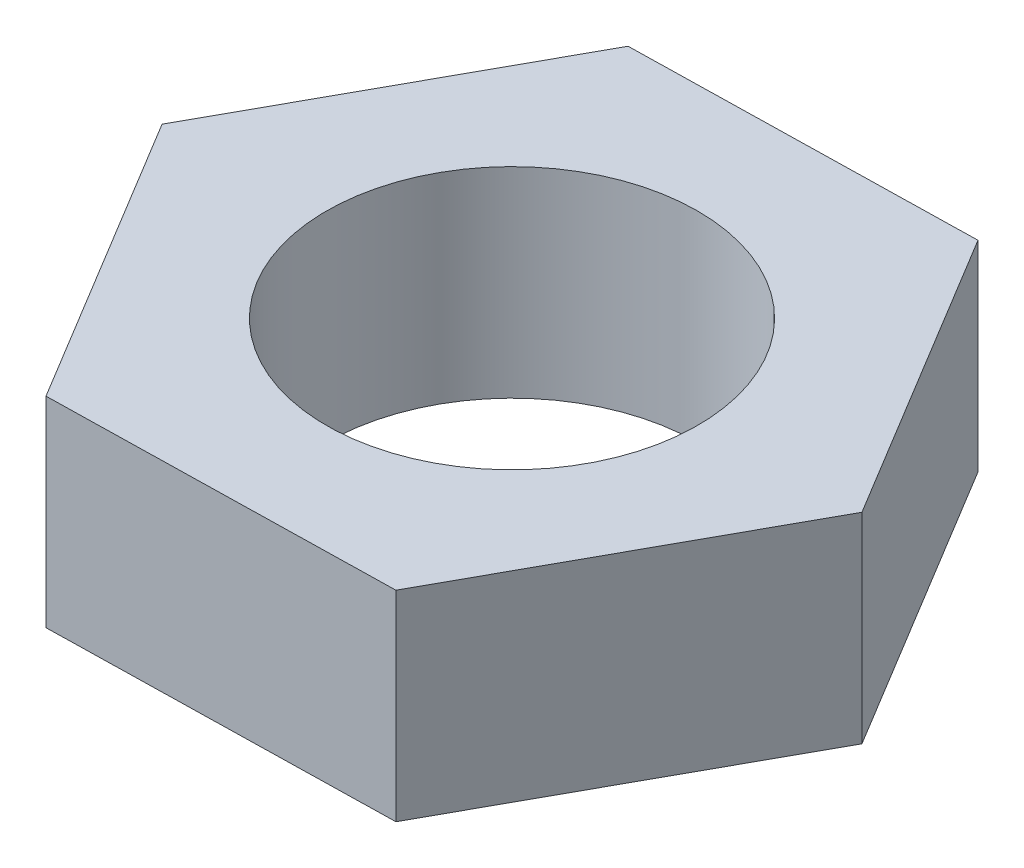
ISO-10303-21;
HEADER;
FILE_DESCRIPTION(('STEP AP214'),'2;1');
FILE_NAME('part.step','',(''),(''),'','','');
FILE_SCHEMA(('AUTOMOTIVE_DESIGN { 1 0 10303 214 1 1 1 1 }'));
ENDSEC;
DATA;
#1=APPLICATION_CONTEXT('core data for automotive mechanical design processes');
#2=APPLICATION_PROTOCOL_DEFINITION('international standard','automotive_design',2000,#1);
#3=PRODUCT_CONTEXT('',#1,'mechanical');
#4=PRODUCT('Part','Part','',(#3));
#5=PRODUCT_RELATED_PRODUCT_CATEGORY('part','',(#4));
#6=PRODUCT_DEFINITION_FORMATION('','',#4);
#7=PRODUCT_DEFINITION_CONTEXT('part definition',#1,'design');
#8=PRODUCT_DEFINITION('design','',#6,#7);
#9=PRODUCT_DEFINITION_SHAPE('','',#8);
#10=(LENGTH_UNIT() NAMED_UNIT(*) SI_UNIT(.MILLI.,.METRE.));
#11=(NAMED_UNIT(*) PLANE_ANGLE_UNIT() SI_UNIT($,.RADIAN.));
#12=(NAMED_UNIT(*) SI_UNIT($,.STERADIAN.) SOLID_ANGLE_UNIT());
#13=UNCERTAINTY_MEASURE_WITH_UNIT(LENGTH_MEASURE(1.E-05),#10,'distance_accuracy_value','');
#14=(GEOMETRIC_REPRESENTATION_CONTEXT(3) GLOBAL_UNCERTAINTY_ASSIGNED_CONTEXT((#13)) GLOBAL_UNIT_ASSIGNED_CONTEXT((#10,
#11,#12)) REPRESENTATION_CONTEXT('',''));
#15=CARTESIAN_POINT('',(0.,0.,0.));
#16=DIRECTION('',(0.,0.,1.));
#17=DIRECTION('',(1.,0.,0.));
#18=AXIS2_PLACEMENT_3D('',#15,#16,#17);
#19=CARTESIAN_POINT('',(0.,2.7,0.));
#20=DIRECTION('',(0.,1.,0.));
#21=DIRECTION('',(0.,0.,1.));
#22=AXIS2_PLACEMENT_3D('',#19,#20,#21);
#23=PLANE('',#22);
#24=DIRECTION('',(0.999795306066237,0.,-0.0202323001144258));
#25=VECTOR('',#24,1.);
#26=CARTESIAN_POINT('',(-2.22799915590976,2.7,4.04590571993452));
#27=LINE('',#26,#25);
#28=CARTESIAN_POINT('',(-2.22799915590976,2.7,4.04590571993452));
#29=VERTEX_POINT('',#28);
#30=CARTESIAN_POINT('',(2.38985755682518,2.7,3.95245672859541));
#31=VERTEX_POINT('',#30);
#32=EDGE_CURVE('E146',#29,#31,#27,.T.);
#33=ORIENTED_EDGE('',*,*,#32,.T.);
#34=DIRECTION('',(0.482375967157035,0.,-0.875964283695012));
#35=VECTOR('',#34,1.);
#36=CARTESIAN_POINT('',(2.38985755682518,2.7,3.95245672859541));
#37=LINE('',#36,#35);
#38=CARTESIAN_POINT('',(4.61785671273495,2.7,-0.0934489913391179));
#39=VERTEX_POINT('',#38);
#40=EDGE_CURVE('E94',#31,#39,#37,.T.);
#41=ORIENTED_EDGE('',*,*,#40,.T.);
#42=DIRECTION('',(-0.517419338909202,0.,-0.855731983580586));
#43=VECTOR('',#42,1.);
#44=CARTESIAN_POINT('',(4.61785671273495,2.7,-0.0934489913391179));
#45=LINE('',#44,#43);
#46=CARTESIAN_POINT('',(2.22799915590977,2.7,-4.04590571993452));
#47=VERTEX_POINT('',#46);
#48=EDGE_CURVE('E107',#39,#47,#45,.T.);
#49=ORIENTED_EDGE('',*,*,#48,.T.);
#50=DIRECTION('',(-0.999795306066237,0.,0.0202323001144258));
#51=VECTOR('',#50,1.);
#52=CARTESIAN_POINT('',(2.22799915590977,2.7,-4.04590571993452));
#53=LINE('',#52,#51);
#54=CARTESIAN_POINT('',(-2.38985755682517,2.7,-3.95245672859541));
#55=VERTEX_POINT('',#54);
#56=EDGE_CURVE('E101',#47,#55,#53,.T.);
#57=ORIENTED_EDGE('',*,*,#56,.T.);
#58=DIRECTION('',(-0.482375967157035,0.,0.875964283695012));
#59=VECTOR('',#58,1.);
#60=CARTESIAN_POINT('',(-2.38985755682517,2.7,-3.95245672859541));
#61=LINE('',#60,#59);
#62=CARTESIAN_POINT('',(-4.61785671273494,2.7,0.0934489913391127));
#63=VERTEX_POINT('',#62);
#64=EDGE_CURVE('E105',#55,#63,#61,.T.);
#65=ORIENTED_EDGE('',*,*,#64,.T.);
#66=DIRECTION('',(0.517419338909203,0.,0.855731983580586));
#67=VECTOR('',#66,1.);
#68=CARTESIAN_POINT('',(-4.61785671273494,2.7,0.0934489913391127));
#69=LINE('',#68,#67);
#70=EDGE_CURVE('E57',#63,#29,#69,.T.);
#71=ORIENTED_EDGE('',*,*,#70,.T.);
#72=EDGE_LOOP('',(#33,#41,#49,#57,#65,#71));
#73=FACE_BOUND('',#72,.T.);
#74=CARTESIAN_POINT('',(0.,2.7,0.));
#75=DIRECTION('',(0.,1.,0.));
#76=DIRECTION('',(0.,0.,1.));
#77=AXIS2_PLACEMENT_3D('',#74,#75,#76);
#78=CIRCLE('',#77,2.5);
#79=CARTESIAN_POINT('',(0.,2.7,-2.5));
#80=VERTEX_POINT('',#79);
#81=EDGE_CURVE('E134',#80,#80,#78,.T.);
#82=ORIENTED_EDGE('',*,*,#81,.F.);
#83=EDGE_LOOP('',(#82));
#84=FACE_BOUND('',#83,.T.);
#85=ADVANCED_FACE('F39',(#73,#84),#23,.T.);
#86=CARTESIAN_POINT('',(0.,0.,0.));
#87=DIRECTION('',(0.,1.,0.));
#88=DIRECTION('',(0.,0.,1.));
#89=AXIS2_PLACEMENT_3D('',#86,#87,#88);
#90=PLANE('',#89);
#91=DIRECTION('',(0.999795306066237,0.,-0.0202323001144258));
#92=VECTOR('',#91,1.);
#93=CARTESIAN_POINT('',(-2.22799915590976,0.,4.04590571993452));
#94=LINE('',#93,#92);
#95=CARTESIAN_POINT('',(-2.22799915590976,0.,4.04590571993452));
#96=VERTEX_POINT('',#95);
#97=CARTESIAN_POINT('',(2.38985755682518,0.,3.95245672859541));
#98=VERTEX_POINT('',#97);
#99=EDGE_CURVE('E129',#96,#98,#94,.T.);
#100=ORIENTED_EDGE('',*,*,#99,.F.);
#101=DIRECTION('',(0.517419338909203,0.,0.855731983580586));
#102=VECTOR('',#101,1.);
#103=CARTESIAN_POINT('',(-4.61785671273494,0.,0.0934489913391127));
#104=LINE('',#103,#102);
#105=CARTESIAN_POINT('',(-4.61785671273494,0.,0.0934489913391127));
#106=VERTEX_POINT('',#105);
#107=EDGE_CURVE('E86',#106,#96,#104,.T.);
#108=ORIENTED_EDGE('',*,*,#107,.F.);
#109=DIRECTION('',(-0.482375967157035,0.,0.875964283695012));
#110=VECTOR('',#109,1.);
#111=CARTESIAN_POINT('',(-2.38985755682517,0.,-3.95245672859541));
#112=LINE('',#111,#110);
#113=CARTESIAN_POINT('',(-2.38985755682517,0.,-3.95245672859541));
#114=VERTEX_POINT('',#113);
#115=EDGE_CURVE('E80',#114,#106,#112,.T.);
#116=ORIENTED_EDGE('',*,*,#115,.F.);
#117=DIRECTION('',(-0.999795306066237,0.,0.0202323001144258));
#118=VECTOR('',#117,1.);
#119=CARTESIAN_POINT('',(2.22799915590977,0.,-4.04590571993452));
#120=LINE('',#119,#118);
#121=CARTESIAN_POINT('',(2.22799915590977,0.,-4.04590571993452));
#122=VERTEX_POINT('',#121);
#123=EDGE_CURVE('E116',#122,#114,#120,.T.);
#124=ORIENTED_EDGE('',*,*,#123,.F.);
#125=DIRECTION('',(-0.517419338909202,0.,-0.855731983580586));
#126=VECTOR('',#125,1.);
#127=CARTESIAN_POINT('',(4.61785671273495,0.,-0.0934489913391179));
#128=LINE('',#127,#126);
#129=CARTESIAN_POINT('',(4.61785671273495,0.,-0.0934489913391179));
#130=VERTEX_POINT('',#129);
#131=EDGE_CURVE('E137',#130,#122,#128,.T.);
#132=ORIENTED_EDGE('',*,*,#131,.F.);
#133=DIRECTION('',(0.482375967157035,0.,-0.875964283695012));
#134=VECTOR('',#133,1.);
#135=CARTESIAN_POINT('',(2.38985755682518,0.,3.95245672859541));
#136=LINE('',#135,#134);
#137=EDGE_CURVE('E133',#98,#130,#136,.T.);
#138=ORIENTED_EDGE('',*,*,#137,.F.);
#139=EDGE_LOOP('',(#100,#108,#116,#124,#132,#138));
#140=FACE_BOUND('',#139,.T.);
#141=CARTESIAN_POINT('',(0.,0.,0.));
#142=DIRECTION('',(0.,1.,0.));
#143=DIRECTION('',(0.,0.,1.));
#144=AXIS2_PLACEMENT_3D('',#141,#142,#143);
#145=CIRCLE('',#144,2.5);
#146=CARTESIAN_POINT('',(0.,0.,-2.5));
#147=VERTEX_POINT('',#146);
#148=EDGE_CURVE('E243',#147,#147,#145,.T.);
#149=ORIENTED_EDGE('',*,*,#148,.T.);
#150=EDGE_LOOP('',(#149));
#151=FACE_BOUND('',#150,.T.);
#152=ADVANCED_FACE('F159',(#140,#151),#90,.F.);
#153=CARTESIAN_POINT('',(-2.22799915590976,2.7,4.04590571993452));
#154=DIRECTION('',(-0.0202323001144258,0.,-0.999795306066237));
#155=DIRECTION('',(-0.999795306066237,0.,0.0202323001144258));
#156=AXIS2_PLACEMENT_3D('',#153,#154,#155);
#157=PLANE('',#156);
#158=ORIENTED_EDGE('',*,*,#99,.T.);
#159=DIRECTION('',(0.,-1.,0.));
#160=VECTOR('',#159,1.);
#161=CARTESIAN_POINT('',(2.38985755682518,2.7,3.95245672859541));
#162=LINE('',#161,#160);
#163=EDGE_CURVE('E11',#31,#98,#162,.T.);
#164=ORIENTED_EDGE('',*,*,#163,.F.);
#165=ORIENTED_EDGE('',*,*,#32,.F.);
#166=DIRECTION('',(0.,-1.,0.));
#167=VECTOR('',#166,1.);
#168=CARTESIAN_POINT('',(-2.22799915590976,2.7,4.04590571993452));
#169=LINE('',#168,#167);
#170=EDGE_CURVE('E125',#29,#96,#169,.T.);
#171=ORIENTED_EDGE('',*,*,#170,.T.);
#172=EDGE_LOOP('',(#158,#164,#165,#171));
#173=FACE_BOUND('',#172,.T.);
#174=ADVANCED_FACE('F41',(#173),#157,.F.);
#175=CARTESIAN_POINT('',(2.38985755682518,2.7,3.95245672859541));
#176=DIRECTION('',(-0.875964283695012,0.,-0.482375967157035));
#177=DIRECTION('',(-0.482375967157035,0.,0.875964283695012));
#178=AXIS2_PLACEMENT_3D('',#175,#176,#177);
#179=PLANE('',#178);
#180=ORIENTED_EDGE('',*,*,#137,.T.);
#181=DIRECTION('',(0.,-1.,0.));
#182=VECTOR('',#181,1.);
#183=CARTESIAN_POINT('',(4.61785671273495,2.7,-0.0934489913391179));
#184=LINE('',#183,#182);
#185=EDGE_CURVE('E49',#39,#130,#184,.T.);
#186=ORIENTED_EDGE('',*,*,#185,.F.);
#187=ORIENTED_EDGE('',*,*,#40,.F.);
#188=ORIENTED_EDGE('',*,*,#163,.T.);
#189=EDGE_LOOP('',(#180,#186,#187,#188));
#190=FACE_BOUND('',#189,.T.);
#191=ADVANCED_FACE('F184',(#190),#179,.F.);
#192=CARTESIAN_POINT('',(4.61785671273495,2.7,-0.0934489913391179));
#193=DIRECTION('',(-0.855731983580586,0.,0.517419338909202));
#194=DIRECTION('',(0.517419338909202,0.,0.855731983580586));
#195=AXIS2_PLACEMENT_3D('',#192,#193,#194);
#196=PLANE('',#195);
#197=ORIENTED_EDGE('',*,*,#131,.T.);
#198=DIRECTION('',(0.,-1.,0.));
#199=VECTOR('',#198,1.);
#200=CARTESIAN_POINT('',(2.22799915590977,2.7,-4.04590571993452));
#201=LINE('',#200,#199);
#202=EDGE_CURVE('E118',#47,#122,#201,.T.);
#203=ORIENTED_EDGE('',*,*,#202,.F.);
#204=ORIENTED_EDGE('',*,*,#48,.F.);
#205=ORIENTED_EDGE('',*,*,#185,.T.);
#206=EDGE_LOOP('',(#197,#203,#204,#205));
#207=FACE_BOUND('',#206,.T.);
#208=ADVANCED_FACE('F156',(#207),#196,.F.);
#209=CARTESIAN_POINT('',(2.22799915590977,2.7,-4.04590571993452));
#210=DIRECTION('',(0.0202323001144258,0.,0.999795306066237));
#211=DIRECTION('',(0.999795306066237,0.,-0.0202323001144258));
#212=AXIS2_PLACEMENT_3D('',#209,#210,#211);
#213=PLANE('',#212);
#214=ORIENTED_EDGE('',*,*,#123,.T.);
#215=DIRECTION('',(0.,-1.,0.));
#216=VECTOR('',#215,1.);
#217=CARTESIAN_POINT('',(-2.38985755682517,2.7,-3.95245672859541));
#218=LINE('',#217,#216);
#219=EDGE_CURVE('E113',#55,#114,#218,.T.);
#220=ORIENTED_EDGE('',*,*,#219,.F.);
#221=ORIENTED_EDGE('',*,*,#56,.F.);
#222=ORIENTED_EDGE('',*,*,#202,.T.);
#223=EDGE_LOOP('',(#214,#220,#221,#222));
#224=FACE_BOUND('',#223,.T.);
#225=ADVANCED_FACE('F114',(#224),#213,.F.);
#226=CARTESIAN_POINT('',(-2.38985755682517,2.7,-3.95245672859541));
#227=DIRECTION('',(0.875964283695012,0.,0.482375967157035));
#228=DIRECTION('',(0.482375967157035,0.,-0.875964283695012));
#229=AXIS2_PLACEMENT_3D('',#226,#227,#228);
#230=PLANE('',#229);
#231=ORIENTED_EDGE('',*,*,#115,.T.);
#232=DIRECTION('',(0.,-1.,0.));
#233=VECTOR('',#232,1.);
#234=CARTESIAN_POINT('',(-4.61785671273494,2.7,0.0934489913391127));
#235=LINE('',#234,#233);
#236=EDGE_CURVE('E119',#63,#106,#235,.T.);
#237=ORIENTED_EDGE('',*,*,#236,.F.);
#238=ORIENTED_EDGE('',*,*,#64,.F.);
#239=ORIENTED_EDGE('',*,*,#219,.T.);
#240=EDGE_LOOP('',(#231,#237,#238,#239));
#241=FACE_BOUND('',#240,.T.);
#242=ADVANCED_FACE('F121',(#241),#230,.F.);
#243=CARTESIAN_POINT('',(-4.61785671273494,2.7,0.0934489913391127));
#244=DIRECTION('',(0.855731983580586,0.,-0.517419338909202));
#245=DIRECTION('',(-0.517419338909203,0.,-0.855731983580586));
#246=AXIS2_PLACEMENT_3D('',#243,#244,#245);
#247=PLANE('',#246);
#248=ORIENTED_EDGE('',*,*,#107,.T.);
#249=ORIENTED_EDGE('',*,*,#170,.F.);
#250=ORIENTED_EDGE('',*,*,#70,.F.);
#251=ORIENTED_EDGE('',*,*,#236,.T.);
#252=EDGE_LOOP('',(#248,#249,#250,#251));
#253=FACE_BOUND('',#252,.T.);
#254=ADVANCED_FACE('F164',(#253),#247,.F.);
#255=CARTESIAN_POINT('',(0.,2.7,0.));
#256=DIRECTION('',(0.,-1.,0.));
#257=DIRECTION('',(0.,0.,-1.));
#258=AXIS2_PLACEMENT_3D('',#255,#256,#257);
#259=CYLINDRICAL_SURFACE('',#258,2.5);
#260=CARTESIAN_POINT('',(0.,2.7,-2.5));
#261=CARTESIAN_POINT('',(0.,2.671875,-2.5));
#262=CARTESIAN_POINT('',(0.,2.64375,-2.5));
#263=CARTESIAN_POINT('',(0.,2.5875,-2.5));
#264=CARTESIAN_POINT('',(0.,2.559375,-2.5));
#265=CARTESIAN_POINT('',(0.,2.503125,-2.5));
#266=CARTESIAN_POINT('',(0.,2.475,-2.5));
#267=CARTESIAN_POINT('',(0.,2.41875,-2.5));
#268=CARTESIAN_POINT('',(0.,2.390625,-2.5));
#269=CARTESIAN_POINT('',(0.,2.334375,-2.5));
#270=CARTESIAN_POINT('',(0.,2.30625,-2.5));
#271=CARTESIAN_POINT('',(0.,2.25,-2.5));
#272=CARTESIAN_POINT('',(0.,2.221875,-2.5));
#273=CARTESIAN_POINT('',(0.,2.165625,-2.5));
#274=CARTESIAN_POINT('',(0.,2.1375,-2.5));
#275=CARTESIAN_POINT('',(0.,2.08125,-2.5));
#276=CARTESIAN_POINT('',(0.,2.053125,-2.5));
#277=CARTESIAN_POINT('',(0.,1.996875,-2.5));
#278=CARTESIAN_POINT('',(0.,1.96875,-2.5));
#279=CARTESIAN_POINT('',(0.,1.9125,-2.5));
#280=CARTESIAN_POINT('',(0.,1.884375,-2.5));
#281=CARTESIAN_POINT('',(0.,1.828125,-2.5));
#282=CARTESIAN_POINT('',(0.,1.8,-2.5));
#283=CARTESIAN_POINT('',(0.,1.74375,-2.5));
#284=CARTESIAN_POINT('',(0.,1.715625,-2.5));
#285=CARTESIAN_POINT('',(0.,1.659375,-2.5));
#286=CARTESIAN_POINT('',(0.,1.63125,-2.5));
#287=CARTESIAN_POINT('',(0.,1.575,-2.5));
#288=CARTESIAN_POINT('',(0.,1.546875,-2.5));
#289=CARTESIAN_POINT('',(0.,1.490625,-2.5));
#290=CARTESIAN_POINT('',(0.,1.4625,-2.5));
#291=CARTESIAN_POINT('',(0.,1.40625,-2.5));
#292=CARTESIAN_POINT('',(0.,1.378125,-2.5));
#293=CARTESIAN_POINT('',(0.,1.321875,-2.5));
#294=CARTESIAN_POINT('',(0.,1.29375,-2.5));
#295=CARTESIAN_POINT('',(0.,1.2375,-2.5));
#296=CARTESIAN_POINT('',(0.,1.209375,-2.5));
#297=CARTESIAN_POINT('',(0.,1.153125,-2.5));
#298=CARTESIAN_POINT('',(0.,1.125,-2.5));
#299=CARTESIAN_POINT('',(0.,1.06875,-2.5));
#300=CARTESIAN_POINT('',(0.,1.040625,-2.5));
#301=CARTESIAN_POINT('',(0.,0.984375,-2.5));
#302=CARTESIAN_POINT('',(0.,0.95625,-2.5));
#303=CARTESIAN_POINT('',(0.,0.9,-2.5));
#304=CARTESIAN_POINT('',(0.,0.871875,-2.5));
#305=CARTESIAN_POINT('',(0.,0.815625,-2.5));
#306=CARTESIAN_POINT('',(0.,0.7875,-2.5));
#307=CARTESIAN_POINT('',(0.,0.73125,-2.5));
#308=CARTESIAN_POINT('',(0.,0.703125,-2.5));
#309=CARTESIAN_POINT('',(0.,0.646875,-2.5));
#310=CARTESIAN_POINT('',(0.,0.61875,-2.5));
#311=CARTESIAN_POINT('',(0.,0.5625,-2.5));
#312=CARTESIAN_POINT('',(0.,0.534375,-2.5));
#313=CARTESIAN_POINT('',(0.,0.478125,-2.5));
#314=CARTESIAN_POINT('',(0.,0.45,-2.5));
#315=CARTESIAN_POINT('',(0.,0.39375,-2.5));
#316=CARTESIAN_POINT('',(0.,0.365625,-2.5));
#317=CARTESIAN_POINT('',(0.,0.309375,-2.5));
#318=CARTESIAN_POINT('',(0.,0.28125,-2.5));
#319=CARTESIAN_POINT('',(0.,0.225,-2.5));
#320=CARTESIAN_POINT('',(0.,0.196875,-2.5));
#321=CARTESIAN_POINT('',(0.,0.140625,-2.5));
#322=CARTESIAN_POINT('',(0.,0.112499999999999,-2.5));
#323=CARTESIAN_POINT('',(0.,0.0562499999999994,-2.5));
#324=CARTESIAN_POINT('',(0.,0.0281249999999995,-2.5));
#325=CARTESIAN_POINT('',(0.,0.,-2.5));
#326=B_SPLINE_CURVE_WITH_KNOTS('',3,(#260,#261,#262,#263,#264,#265,#266,#267,#268,#269,#270,
#271,#272,#273,#274,#275,#276,#277,#278,#279,#280,#281,#282,#283,#284,#285,#286,#287,#288,#289,
#290,#291,#292,#293,#294,#295,#296,#297,#298,#299,#300,#301,#302,#303,#304,#305,#306,#307,#308,
#309,#310,#311,#312,#313,#314,#315,#316,#317,#318,#319,#320,#321,#322,#323,#324,#325),
.UNSPECIFIED.,.F.,.F.,(4,2,2,2,2,2,2,2,2,2,2,2,2,2,2,2,2,2,2,2,2,2,2,2,2,2,2,2,2,2,2,2,4),(0.,
0.0843749999999998,0.16875,0.253125,0.3375,0.421875,0.50625,0.590625,0.675,0.759375,0.84375,
0.928125,1.0125,1.096875,1.18125,1.265625,1.35,1.434375,1.51875,1.603125,1.6875,1.771875,
1.85625,1.940625,2.025,2.109375,2.19375,2.278125,2.3625,2.446875,2.53125,2.615625,2.7),.UNSPECIFIED.);
#327=EDGE_CURVE('BSEAM166',#80,#147,#326,.T.);
#328=ORIENTED_EDGE('',*,*,#81,.T.);
#329=ORIENTED_EDGE('',*,*,#148,.F.);
#330=ORIENTED_EDGE('',*,*,#327,.T.);
#331=ORIENTED_EDGE('',*,*,#327,.F.);
#332=EDGE_LOOP('',(#328,#330,#329,#331));
#333=FACE_BOUND('',#332,.T.);
#334=ADVANCED_FACE('F166',(#333),#259,.F.);
#335=CLOSED_SHELL('',(#85,#152,#174,#191,#208,#225,#242,#254,#334));
#336=MANIFOLD_SOLID_BREP('B2',#335);
#337=ADVANCED_BREP_SHAPE_REPRESENTATION('',(#18,#336),#14);
#338=SHAPE_DEFINITION_REPRESENTATION(#9,#337);
ENDSEC;
END-ISO-10303-21;
